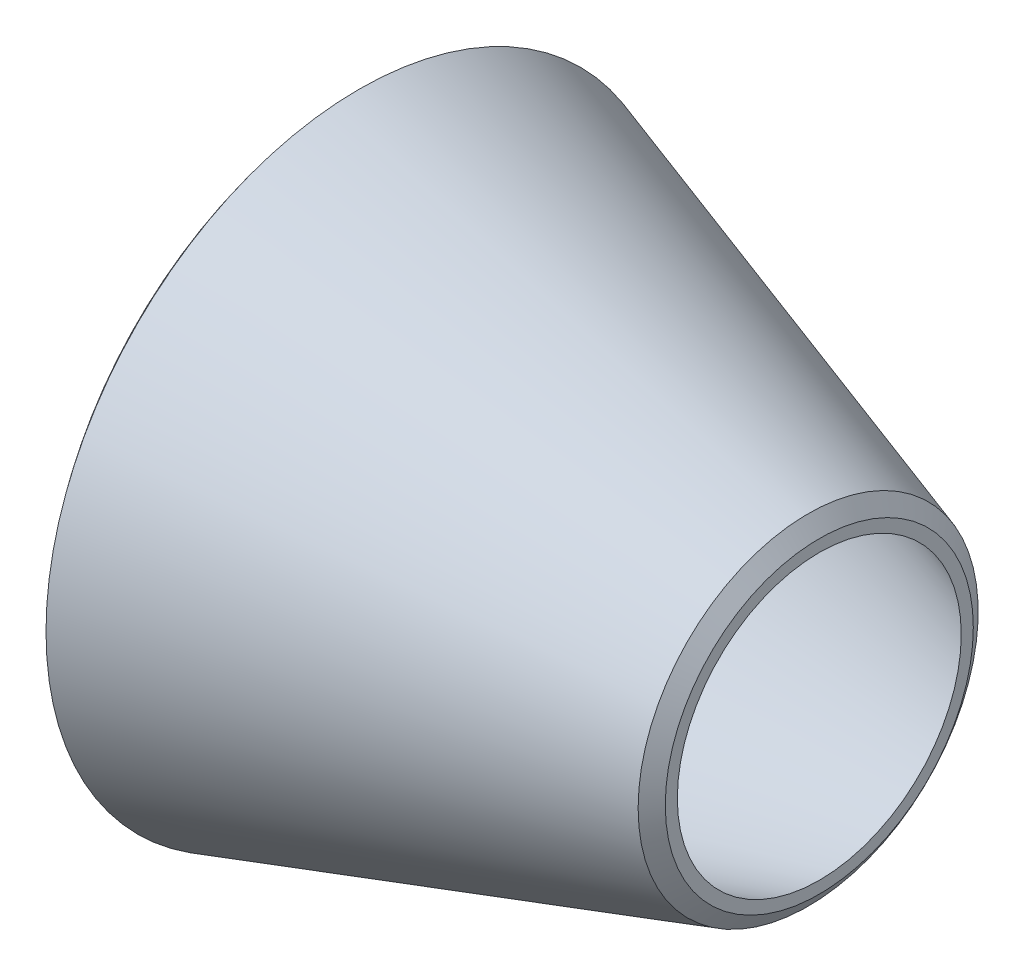
ISO-10303-21;
HEADER;
FILE_DESCRIPTION(('STEP AP214'),'2;1');
FILE_NAME('part.step','',(''),(''),'','','');
FILE_SCHEMA(('AUTOMOTIVE_DESIGN { 1 0 10303 214 1 1 1 1 }'));
ENDSEC;
DATA;
#1=APPLICATION_CONTEXT('core data for automotive mechanical design processes');
#2=APPLICATION_PROTOCOL_DEFINITION('international standard','automotive_design',2000,#1);
#3=PRODUCT_CONTEXT('',#1,'mechanical');
#4=PRODUCT('Part','Part','',(#3));
#5=PRODUCT_RELATED_PRODUCT_CATEGORY('part','',(#4));
#6=PRODUCT_DEFINITION_FORMATION('','',#4);
#7=PRODUCT_DEFINITION_CONTEXT('part definition',#1,'design');
#8=PRODUCT_DEFINITION('design','',#6,#7);
#9=PRODUCT_DEFINITION_SHAPE('','',#8);
#10=(LENGTH_UNIT() NAMED_UNIT(*) SI_UNIT(.MILLI.,.METRE.));
#11=(NAMED_UNIT(*) PLANE_ANGLE_UNIT() SI_UNIT($,.RADIAN.));
#12=(NAMED_UNIT(*) SI_UNIT($,.STERADIAN.) SOLID_ANGLE_UNIT());
#13=UNCERTAINTY_MEASURE_WITH_UNIT(LENGTH_MEASURE(1.E-05),#10,'distance_accuracy_value','');
#14=(GEOMETRIC_REPRESENTATION_CONTEXT(3) GLOBAL_UNCERTAINTY_ASSIGNED_CONTEXT((#13)) GLOBAL_UNIT_ASSIGNED_CONTEXT((#10,
#11,#12)) REPRESENTATION_CONTEXT('',''));
#15=CARTESIAN_POINT('',(0.,0.,0.));
#16=DIRECTION('',(0.,0.,1.));
#17=DIRECTION('',(1.,0.,0.));
#18=AXIS2_PLACEMENT_3D('',#15,#16,#17);
#19=CARTESIAN_POINT('',(79.9999999999983,0.,-7.105427357601E-12));
#20=DIRECTION('',(0.999999999999998,0.,0.));
#21=DIRECTION('',(0.,0.,-1.));
#22=AXIS2_PLACEMENT_3D('',#19,#20,#21);
#23=PLANE('',#22);
#24=CARTESIAN_POINT('',(79.9999999999983,0.,-7.105427357601E-12));
#25=DIRECTION('',(0.999999999999998,0.,0.));
#26=DIRECTION('',(0.,0.,-1.));
#27=AXIS2_PLACEMENT_3D('',#24,#25,#26);
#28=CIRCLE('',#27,26.3677534971864);
#29=CARTESIAN_POINT('',(79.9999999999983,0.,26.3677534971793));
#30=VERTEX_POINT('',#29);
#31=EDGE_CURVE('E72',#30,#30,#28,.T.);
#32=ORIENTED_EDGE('',*,*,#31,.T.);
#33=EDGE_LOOP('',(#32));
#34=FACE_BOUND('',#33,.T.);
#35=CARTESIAN_POINT('',(79.9999999999983,0.,-7.105427357601E-12));
#36=DIRECTION('',(0.999999999999998,0.,0.));
#37=DIRECTION('',(0.,0.,-1.));
#38=AXIS2_PLACEMENT_3D('',#35,#36,#37);
#39=CIRCLE('',#38,24.3017116583065);
#40=CARTESIAN_POINT('',(79.9999999999983,-7.04788094799131E-12,24.3017116583066));
#41=VERTEX_POINT('',#40);
#42=EDGE_CURVE('E78',#41,#41,#39,.T.);
#43=ORIENTED_EDGE('',*,*,#42,.F.);
#44=EDGE_LOOP('',(#43));
#45=FACE_BOUND('',#44,.T.);
#46=ADVANCED_FACE('F57',(#34,#45),#23,.T.);
#47=CARTESIAN_POINT('',(0.,0.,0.));
#48=DIRECTION('',(0.999999999999998,0.,0.));
#49=DIRECTION('',(0.,0.,-1.));
#50=AXIS2_PLACEMENT_3D('',#47,#48,#49);
#51=PLANE('',#50);
#52=CARTESIAN_POINT('',(0.,0.,0.));
#53=DIRECTION('',(0.999999999999998,0.,0.));
#54=DIRECTION('',(0.,0.,-1.));
#55=AXIS2_PLACEMENT_3D('',#52,#53,#54);
#56=CIRCLE('',#55,52.);
#57=CARTESIAN_POINT('',(0.,-1.32782673745169E-13,-52.));
#58=VERTEX_POINT('',#57);
#59=EDGE_CURVE('E12',#58,#58,#56,.F.);
#60=ORIENTED_EDGE('',*,*,#59,.T.);
#61=EDGE_LOOP('',(#60));
#62=FACE_BOUND('',#61,.T.);
#63=CARTESIAN_POINT('',(0.,0.,0.));
#64=DIRECTION('',(0.999999999999998,0.,0.));
#65=DIRECTION('',(0.,0.,-1.));
#66=AXIS2_PLACEMENT_3D('',#63,#64,#65);
#67=CIRCLE('',#66,49.8017116583065);
#68=CARTESIAN_POINT('',(0.,-6.97832547549855E-12,49.8017116583061));
#69=VERTEX_POINT('',#68);
#70=EDGE_CURVE('E77',#69,#69,#67,.T.);
#71=ORIENTED_EDGE('',*,*,#70,.T.);
#72=EDGE_LOOP('',(#71));
#73=FACE_BOUND('',#72,.T.);
#74=ADVANCED_FACE('F84',(#62,#73),#51,.F.);
#75=CARTESIAN_POINT('',(0.,0.,0.));
#76=DIRECTION('',(-0.999999999999998,0.,0.));
#77=DIRECTION('',(0.,0.,1.));
#78=AXIS2_PLACEMENT_3D('',#75,#76,#77);
#79=CONICAL_SURFACE('',#78,54.,0.308568643758517);
#80=CARTESIAN_POINT('',(78.0944615164856,0.,0.));
#81=DIRECTION('',(0.999999999999998,0.,0.));
#82=DIRECTION('',(0.,0.,-1.));
#83=AXIS2_PLACEMENT_3D('',#80,#81,#82);
#84=CIRCLE('',#83,29.1073903916212);
#85=CARTESIAN_POINT('',(78.0944615164856,0.,29.1073903916201));
#86=VERTEX_POINT('',#85);
#87=EDGE_CURVE('E64',#86,#86,#84,.F.);
#88=CARTESIAN_POINT('',(1.23306434455372,0.,0.));
#89=DIRECTION('',(-0.999999999999998,0.,0.));
#90=DIRECTION('',(0.,0.,1.));
#91=AXIS2_PLACEMENT_3D('',#88,#89,#90);
#92=CIRCLE('',#91,53.6069607401725);
#93=CARTESIAN_POINT('',(1.23306434455374,1.36817619994702E-13,53.6069607401735));
#94=VERTEX_POINT('',#93);
#95=EDGE_CURVE('E68',#94,#94,#92,.F.);
#96=CARTESIAN_POINT('',(78.0944615164856,0.,29.1073903916201));
#97=CARTESIAN_POINT('',(77.2938219626113,0.,29.3625942494176));
#98=CARTESIAN_POINT('',(76.493182408737,0.,29.617798107215));
#99=CARTESIAN_POINT('',(74.8919033009884,0.,30.1282058228099));
#100=CARTESIAN_POINT('',(74.0912637471141,0.,30.3834096806073));
#101=CARTESIAN_POINT('',(72.4899846393656,0.,30.8938173962022));
#102=CARTESIAN_POINT('',(71.6893450854913,0.,31.1490212539996));
#103=CARTESIAN_POINT('',(70.0880659777427,0.,31.6594289695944));
#104=CARTESIAN_POINT('',(69.2874264238684,0.,31.9146328273919));
#105=CARTESIAN_POINT('',(67.6861473161198,0.,32.4250405429867));
#106=CARTESIAN_POINT('',(66.8855077622455,0.,32.6802444007842));
#107=CARTESIAN_POINT('',(65.2842286544969,0.,33.190652116379));
#108=CARTESIAN_POINT('',(64.4835891006226,0.,33.4458559741765));
#109=CARTESIAN_POINT('',(62.8823099928741,0.,33.9562636897713));
#110=CARTESIAN_POINT('',(62.0816704389998,0.,34.2114675475687));
#111=CARTESIAN_POINT('',(60.4803913312512,0.,34.7218752631636));
#112=CARTESIAN_POINT('',(59.6797517773769,0.,34.977079120961));
#113=CARTESIAN_POINT('',(58.0784726696283,0.,35.4874868365559));
#114=CARTESIAN_POINT('',(57.277833115754,0.,35.7426906943533));
#115=CARTESIAN_POINT('',(55.6765540080055,0.,36.2530984099482));
#116=CARTESIAN_POINT('',(54.8759144541312,0.,36.5083022677456));
#117=CARTESIAN_POINT('',(53.2746353463826,0.,37.0187099833405));
#118=CARTESIAN_POINT('',(52.4739957925083,0.,37.2739138411379));
#119=CARTESIAN_POINT('',(50.8727166847597,0.,37.7843215567328));
#120=CARTESIAN_POINT('',(50.0720771308854,0.,38.0395254145302));
#121=CARTESIAN_POINT('',(48.4707980231369,0.,38.5499331301251));
#122=CARTESIAN_POINT('',(47.6701584692626,0.,38.8051369879225));
#123=CARTESIAN_POINT('',(46.068879361514,0.,39.3155447035174));
#124=CARTESIAN_POINT('',(45.2682398076397,0.,39.5707485613148));
#125=CARTESIAN_POINT('',(43.6669606998911,0.,40.0811562769096));
#126=CARTESIAN_POINT('',(42.8663211460168,1.00619859391721E-13,40.3363601347071));
#127=CARTESIAN_POINT('',(41.2650420382682,1.02012080953374E-13,40.8467678503019));
#128=CARTESIAN_POINT('',(40.464402484394,1.02708191734201E-13,41.1019717080994));
#129=CARTESIAN_POINT('',(38.8631233766454,1.04100413295854E-13,41.6123794236942));
#130=CARTESIAN_POINT('',(38.0624838227711,1.04796524076681E-13,41.8675832814917));
#131=CARTESIAN_POINT('',(36.4612047150225,1.06188745638334E-13,42.3779909970865));
#132=CARTESIAN_POINT('',(35.6605651611482,1.0688485641916E-13,42.6331948548839));
#133=CARTESIAN_POINT('',(34.0592860533996,1.08277077980813E-13,43.1436025704788));
#134=CARTESIAN_POINT('',(33.2586464995253,1.0897318876164E-13,43.3988064282762));
#135=CARTESIAN_POINT('',(31.6573673917768,1.10365410323293E-13,43.9092141438711));
#136=CARTESIAN_POINT('',(30.8567278379025,1.11061521104119E-13,44.1644180016685));
#137=CARTESIAN_POINT('',(29.2554487301539,1.12453742665773E-13,44.6748257172634));
#138=CARTESIAN_POINT('',(28.4548091762796,1.13149853446599E-13,44.9300295750608));
#139=CARTESIAN_POINT('',(26.853530068531,1.14542075008252E-13,45.4404372906557));
#140=CARTESIAN_POINT('',(26.0528905146567,1.15238185789079E-13,45.6956411484531));
#141=CARTESIAN_POINT('',(24.4516114069082,1.16630407350732E-13,46.206048864048));
#142=CARTESIAN_POINT('',(23.6509718530339,1.17326518131558E-13,46.4612527218454));
#143=CARTESIAN_POINT('',(22.0496927452853,1.18718739693211E-13,46.9716604374403));
#144=CARTESIAN_POINT('',(21.249053191411,1.19414850474038E-13,47.2268642952377));
#145=CARTESIAN_POINT('',(19.6477740836624,1.20807072035691E-13,47.7372720108326));
#146=CARTESIAN_POINT('',(18.8471345297881,1.21503182816518E-13,47.99247586863));
#147=CARTESIAN_POINT('',(17.2458554220395,1.22895404378171E-13,48.5028835842249));
#148=CARTESIAN_POINT('',(16.4452158681652,1.23591515158997E-13,48.7580874420223));
#149=CARTESIAN_POINT('',(14.8439367604167,1.2498373672065E-13,49.2684951576171));
#150=CARTESIAN_POINT('',(14.0432972065424,1.25679847501477E-13,49.5236990154146));
#151=CARTESIAN_POINT('',(12.4420180987938,1.2707206906313E-13,50.0341067310094));
#152=CARTESIAN_POINT('',(11.6413785449195,1.27768179843957E-13,50.2893105888069));
#153=CARTESIAN_POINT('',(10.0400994371709,1.2916040140561E-13,50.7997183044017));
#154=CARTESIAN_POINT('',(9.23945988329664,1.29856512186436E-13,51.0549221621992));
#155=CARTESIAN_POINT('',(7.63818077554807,1.31248733748089E-13,51.565329877794));
#156=CARTESIAN_POINT('',(6.83754122167378,1.31944844528916E-13,51.8205337355915));
#157=CARTESIAN_POINT('',(5.23626211392519,1.33337066090569E-13,52.3309414511863));
#158=CARTESIAN_POINT('',(4.4356225600509,1.34033176871395E-13,52.5861453089838));
#159=CARTESIAN_POINT('',(2.83434345230232,1.35425398433049E-13,53.0965530245786));
#160=CARTESIAN_POINT('',(2.03370389842803,1.36121509213875E-13,53.351756882376));
#161=CARTESIAN_POINT('',(1.23306434455374,1.36817619994702E-13,53.6069607401735));
#162=B_SPLINE_CURVE_WITH_KNOTS('',3,(#96,#97,#98,#99,#100,#101,#102,#103,#104,#105,#106,#107,
#108,#109,#110,#111,#112,#113,#114,#115,#116,#117,#118,#119,#120,#121,#122,#123,#124,#125,#126,
#127,#128,#129,#130,#131,#132,#133,#134,#135,#136,#137,#138,#139,#140,#141,#142,#143,#144,#145,
#146,#147,#148,#149,#150,#151,#152,#153,#154,#155,#156,#157,#158,#159,#160,#161),.UNSPECIFIED.,
.F.,.F.,(4,2,2,2,2,2,2,2,2,2,2,2,2,2,2,2,2,2,2,2,2,2,2,2,2,2,2,2,2,2,2,2,4),(0.,
2.52098677869687,5.04197355739374,7.56296033609061,10.0839471147875,12.6049338934844,
15.1259206721812,17.6469074508781,20.167894229575,22.6888810082718,25.2098677869687,
27.7308545656656,30.2518413443624,32.7728281230593,35.2938149017562,37.814801680453,
40.3357884591499,42.8567752378468,45.3777620165437,47.8987487952405,50.4197355739374,
52.9407223526343,55.4617091313311,57.982695910028,60.5036826887249,63.0246694674217,
65.5456562461186,68.0666430248155,70.5876298035124,73.1086165822092,75.6296033609061,
78.150590139603,80.6715769182998),.UNSPECIFIED.);
#163=EDGE_CURVE('BSEAM90',#86,#94,#162,.T.);
#164=ORIENTED_EDGE('',*,*,#87,.T.);
#165=ORIENTED_EDGE('',*,*,#95,.T.);
#166=ORIENTED_EDGE('',*,*,#163,.T.);
#167=ORIENTED_EDGE('',*,*,#163,.F.);
#168=EDGE_LOOP('',(#164,#166,#165,#167));
#169=FACE_BOUND('',#168,.T.);
#170=ADVANCED_FACE('F90',(#169),#79,.T.);
#171=CARTESIAN_POINT('',(-1.21478078324344,-7.105427357601E-12,0.));
#172=DIRECTION('',(-0.999999999999998,0.,0.));
#173=DIRECTION('',(0.,0.,1.));
#174=AXIS2_PLACEMENT_3D('',#171,#172,#173);
#175=CONICAL_SURFACE('',#174,50.188923032965,0.308568643758517);
#176=CARTESIAN_POINT('',(0.,-6.97832547549855E-12,49.8017116583061));
#177=CARTESIAN_POINT('',(0.833333333333328,-6.97905001167034E-12,49.5360866583061));
#178=CARTESIAN_POINT('',(1.66666666666664,-6.97977454784214E-12,49.2704616583061));
#179=CARTESIAN_POINT('',(3.33333333333327,-6.98122362018574E-12,48.7392116583061));
#180=CARTESIAN_POINT('',(4.16666666666659,-6.98194815635754E-12,48.4735866583061));
#181=CARTESIAN_POINT('',(5.83333333333322,-6.98339722870114E-12,47.9423366583061));
#182=CARTESIAN_POINT('',(6.66666666666654,-6.98412176487294E-12,47.6767116583061));
#183=CARTESIAN_POINT('',(8.33333333333317,-6.98557083721654E-12,47.1454616583061));
#184=CARTESIAN_POINT('',(9.16666666666648,-6.98629537338834E-12,46.8798366583061));
#185=CARTESIAN_POINT('',(10.8333333333331,-6.98774444573194E-12,46.3485866583062));
#186=CARTESIAN_POINT('',(11.6666666666664,-6.98846898190374E-12,46.0829616583062));
#187=CARTESIAN_POINT('',(13.3333333333331,-6.98991805424734E-12,45.5517116583062));
#188=CARTESIAN_POINT('',(14.1666666666664,-6.99064259041914E-12,45.2860866583062));
#189=CARTESIAN_POINT('',(15.833333333333,-6.99209166276274E-12,44.7548366583062));
#190=CARTESIAN_POINT('',(16.6666666666663,-6.99281619893454E-12,44.4892116583062));
#191=CARTESIAN_POINT('',(18.333333333333,-6.99426527127814E-12,43.9579616583062));
#192=CARTESIAN_POINT('',(19.1666666666663,-6.99498980744994E-12,43.6923366583062));
#193=CARTESIAN_POINT('',(20.8333333333329,-6.99643887979354E-12,43.1610866583062));
#194=CARTESIAN_POINT('',(21.6666666666662,-6.99716341596534E-12,42.8954616583062));
#195=CARTESIAN_POINT('',(23.3333333333328,-6.99861248830894E-12,42.3642116583062));
#196=CARTESIAN_POINT('',(24.1666666666662,-6.99933702448074E-12,42.0985866583062));
#197=CARTESIAN_POINT('',(25.8333333333328,-7.00078609682433E-12,41.5673366583062));
#198=CARTESIAN_POINT('',(26.6666666666661,-7.00151063299613E-12,41.3017116583063));
#199=CARTESIAN_POINT('',(28.3333333333327,-7.00295970533973E-12,40.7704616583063));
#200=CARTESIAN_POINT('',(29.166666666666,-7.00368424151153E-12,40.5048366583063));
#201=CARTESIAN_POINT('',(30.8333333333327,-7.00513331385513E-12,39.9735866583063));
#202=CARTESIAN_POINT('',(31.666666666666,-7.00585785002693E-12,39.7079616583063));
#203=CARTESIAN_POINT('',(33.3333333333326,-7.00730692237053E-12,39.1767116583063));
#204=CARTESIAN_POINT('',(34.1666666666659,-7.00803145854233E-12,38.9110866583063));
#205=CARTESIAN_POINT('',(35.8333333333326,-7.00948053088593E-12,38.3798366583063));
#206=CARTESIAN_POINT('',(36.6666666666659,-7.01020506705773E-12,38.1142116583063));
#207=CARTESIAN_POINT('',(38.3333333333325,-7.01165413940133E-12,37.5829616583063));
#208=CARTESIAN_POINT('',(39.1666666666658,-7.01237867557313E-12,37.3173366583063));
#209=CARTESIAN_POINT('',(40.8333333333325,-7.01382774791673E-12,36.7860866583063));
#210=CARTESIAN_POINT('',(41.6666666666658,-7.01455228408853E-12,36.5204616583064));
#211=CARTESIAN_POINT('',(43.3333333333324,-7.01600135643213E-12,35.9892116583064));
#212=CARTESIAN_POINT('',(44.1666666666657,-7.01672589260393E-12,35.7235866583064));
#213=CARTESIAN_POINT('',(45.8333333333324,-7.01817496494753E-12,35.1923366583064));
#214=CARTESIAN_POINT('',(46.6666666666657,-7.01889950111932E-12,34.9267116583064));
#215=CARTESIAN_POINT('',(48.3333333333323,-7.02034857346292E-12,34.3954616583064));
#216=CARTESIAN_POINT('',(49.1666666666656,-7.02107310963472E-12,34.1298366583064));
#217=CARTESIAN_POINT('',(50.8333333333322,-7.02252218197832E-12,33.5985866583064));
#218=CARTESIAN_POINT('',(51.6666666666656,-7.02324671815012E-12,33.3329616583064));
#219=CARTESIAN_POINT('',(53.3333333333322,-7.02469579049372E-12,32.8017116583064));
#220=CARTESIAN_POINT('',(54.1666666666655,-7.02542032666552E-12,32.5360866583064));
#221=CARTESIAN_POINT('',(55.8333333333321,-7.02686939900912E-12,32.0048366583064));
#222=CARTESIAN_POINT('',(56.6666666666654,-7.02759393518092E-12,31.7392116583064));
#223=CARTESIAN_POINT('',(58.3333333333321,-7.02904300752452E-12,31.2079616583065));
#224=CARTESIAN_POINT('',(59.1666666666654,-7.02976754369632E-12,30.9423366583065));
#225=CARTESIAN_POINT('',(60.833333333332,-7.03121661603992E-12,30.4110866583065));
#226=CARTESIAN_POINT('',(61.6666666666653,-7.03194115221172E-12,30.1454616583065));
#227=CARTESIAN_POINT('',(63.333333333332,-7.03339022455532E-12,29.6142116583065));
#228=CARTESIAN_POINT('',(64.1666666666653,-7.03411476072712E-12,29.3485866583065));
#229=CARTESIAN_POINT('',(65.8333333333319,-7.03556383307072E-12,28.8173366583065));
#230=CARTESIAN_POINT('',(66.6666666666653,-7.03628836924252E-12,28.5517116583065));
#231=CARTESIAN_POINT('',(68.3333333333319,-7.03773744158612E-12,28.0204616583065));
#232=CARTESIAN_POINT('',(69.1666666666652,-7.03846197775792E-12,27.7548366583065));
#233=CARTESIAN_POINT('',(70.8333333333318,-7.03991105010151E-12,27.2235866583065));
#234=CARTESIAN_POINT('',(71.6666666666651,-7.04063558627331E-12,26.9579616583065));
#235=CARTESIAN_POINT('',(73.3333333333318,-7.04208465861691E-12,26.4267116583065));
#236=CARTESIAN_POINT('',(74.1666666666651,-7.04280919478871E-12,26.1610866583065));
#237=CARTESIAN_POINT('',(75.8333333333317,-7.04425826713231E-12,25.6298366583066));
#238=CARTESIAN_POINT('',(76.666666666665,-7.04498280330411E-12,25.3642116583066));
#239=CARTESIAN_POINT('',(78.3333333333317,-7.04643187564771E-12,24.8329616583066));
#240=CARTESIAN_POINT('',(79.166666666665,-7.04715641181951E-12,24.5673366583066));
#241=CARTESIAN_POINT('',(79.9999999999983,-7.04788094799131E-12,24.3017116583066));
#242=B_SPLINE_CURVE_WITH_KNOTS('',3,(#176,#177,#178,#179,#180,#181,#182,#183,#184,#185,#186,
#187,#188,#189,#190,#191,#192,#193,#194,#195,#196,#197,#198,#199,#200,#201,#202,#203,#204,#205,
#206,#207,#208,#209,#210,#211,#212,#213,#214,#215,#216,#217,#218,#219,#220,#221,#222,#223,#224,
#225,#226,#227,#228,#229,#230,#231,#232,#233,#234,#235,#236,#237,#238,#239,#240,#241),
.UNSPECIFIED.,.F.,.F.,(4,2,2,2,2,2,2,2,2,2,2,2,2,2,2,2,2,2,2,2,2,2,2,2,2,2,2,2,2,2,2,2,4),(0.,
2.62393021355842,5.24786042711683,7.87179064067524,10.4957208542337,13.1196510677921,
15.7435812813505,18.3675114949089,20.9914417084673,23.6153719220257,26.2393021355841,
28.8632323491426,31.487162562701,34.1110927762594,36.7350229898178,39.3589532033762,
41.9828834169346,44.6068136304931,47.2307438440515,49.8546740576099,52.4786042711683,
55.1025344847267,57.7264646982851,60.3503949118435,62.9743251254019,65.5982553389604,
68.2221855525188,70.8461157660772,73.4700459796356,76.0939761931941,78.7179064067525,
81.3418366203109,83.9657668338693),.UNSPECIFIED.);
#243=EDGE_CURVE('BSEAM86',#69,#41,#242,.T.);
#244=ORIENTED_EDGE('',*,*,#70,.F.);
#245=ORIENTED_EDGE('',*,*,#42,.T.);
#246=ORIENTED_EDGE('',*,*,#243,.T.);
#247=ORIENTED_EDGE('',*,*,#243,.F.);
#248=EDGE_LOOP('',(#244,#246,#245,#247));
#249=FACE_BOUND('',#248,.T.);
#250=ADVANCED_FACE('F86',(#249),#175,.F.);
#251=CARTESIAN_POINT('',(79.9999999999983,0.,-7.105427357601E-12));
#252=DIRECTION('',(-0.999999999999998,0.,0.));
#253=DIRECTION('',(0.,0.,1.));
#254=AXIS2_PLACEMENT_3D('',#251,#252,#253);
#255=CONICAL_SURFACE('',#254,26.3677534971864,0.963067113256386);
#256=CARTESIAN_POINT('',(78.0944615164856,0.,29.1073903916072));
#257=CARTESIAN_POINT('',(78.1143108756889,0.,29.0788525072902));
#258=CARTESIAN_POINT('',(78.1341602348921,0.,29.0503146229733));
#259=CARTESIAN_POINT('',(78.1738589532986,0.,28.9932388543393));
#260=CARTESIAN_POINT('',(78.1937083125019,0.,28.9647009700224));
#261=CARTESIAN_POINT('',(78.2334070309084,0.,28.9076252013885));
#262=CARTESIAN_POINT('',(78.2532563901117,0.,28.8790873170715));
#263=CARTESIAN_POINT('',(78.2929551085182,0.,28.8220115484376));
#264=CARTESIAN_POINT('',(78.3128044677214,0.,28.7934736641206));
#265=CARTESIAN_POINT('',(78.3525031861279,0.,28.7363978954867));
#266=CARTESIAN_POINT('',(78.3723525453312,0.,28.7078600111698));
#267=CARTESIAN_POINT('',(78.4120512637377,0.,28.6507842425359));
#268=CARTESIAN_POINT('',(78.431900622941,0.,28.6222463582189));
#269=CARTESIAN_POINT('',(78.4715993413475,0.,28.565170589585));
#270=CARTESIAN_POINT('',(78.4914487005507,0.,28.536632705268));
#271=CARTESIAN_POINT('',(78.5311474189572,0.,28.4795569366341));
#272=CARTESIAN_POINT('',(78.5509967781605,0.,28.4510190523172));
#273=CARTESIAN_POINT('',(78.590695496567,0.,28.3939432836832));
#274=CARTESIAN_POINT('',(78.6105448557703,0.,28.3654053993663));
#275=CARTESIAN_POINT('',(78.6502435741768,0.,28.3083296307324));
#276=CARTESIAN_POINT('',(78.6700929333801,0.,28.2797917464154));
#277=CARTESIAN_POINT('',(78.7097916517866,0.,28.2227159777815));
#278=CARTESIAN_POINT('',(78.7296410109898,0.,28.1941780934645));
#279=CARTESIAN_POINT('',(78.7693397293963,0.,28.1371023248306));
#280=CARTESIAN_POINT('',(78.7891890885996,0.,28.1085644405137));
#281=CARTESIAN_POINT('',(78.8288878070061,0.,28.0514886718798));
#282=CARTESIAN_POINT('',(78.8487371662094,0.,28.0229507875628));
#283=CARTESIAN_POINT('',(78.8884358846159,0.,27.9658750189289));
#284=CARTESIAN_POINT('',(78.9082852438191,0.,27.9373371346119));
#285=CARTESIAN_POINT('',(78.9479839622256,0.,27.880261365978));
#286=CARTESIAN_POINT('',(78.9678333214289,0.,27.8517234816611));
#287=CARTESIAN_POINT('',(79.0075320398354,0.,27.7946477130271));
#288=CARTESIAN_POINT('',(79.0273813990387,0.,27.7661098287102));
#289=CARTESIAN_POINT('',(79.0670801174452,0.,27.7090340600763));
#290=CARTESIAN_POINT('',(79.0869294766485,0.,27.6804961757593));
#291=CARTESIAN_POINT('',(79.126628195055,0.,27.6234204071254));
#292=CARTESIAN_POINT('',(79.1464775542582,0.,27.5948825228084));
#293=CARTESIAN_POINT('',(79.1861762726648,0.,27.5378067541745));
#294=CARTESIAN_POINT('',(79.206025631868,0.,27.5092688698576));
#295=CARTESIAN_POINT('',(79.2457243502745,0.,27.4521931012237));
#296=CARTESIAN_POINT('',(79.2655737094778,0.,27.4236552169067));
#297=CARTESIAN_POINT('',(79.3052724278843,0.,27.3665794482728));
#298=CARTESIAN_POINT('',(79.3251217870875,0.,27.3380415639558));
#299=CARTESIAN_POINT('',(79.3648205054941,0.,27.2809657953219));
#300=CARTESIAN_POINT('',(79.3846698646973,0.,27.252427911005));
#301=CARTESIAN_POINT('',(79.4243685831038,0.,27.195352142371));
#302=CARTESIAN_POINT('',(79.4442179423071,0.,27.1668142580541));
#303=CARTESIAN_POINT('',(79.4839166607136,0.,27.1097384894202));
#304=CARTESIAN_POINT('',(79.5037660199169,0.,27.0812006051032));
#305=CARTESIAN_POINT('',(79.5434647383234,0.,27.0241248364693));
#306=CARTESIAN_POINT('',(79.5633140975266,0.,26.9955869521523));
#307=CARTESIAN_POINT('',(79.6030128159331,0.,26.9385111835184));
#308=CARTESIAN_POINT('',(79.6228621751364,0.,26.9099732992015));
#309=CARTESIAN_POINT('',(79.6625608935429,0.,26.8528975305676));
#310=CARTESIAN_POINT('',(79.6824102527462,0.,26.8243596462506));
#311=CARTESIAN_POINT('',(79.7221089711527,0.,26.7672838776167));
#312=CARTESIAN_POINT('',(79.741958330356,0.,26.7387459932997));
#313=CARTESIAN_POINT('',(79.7816570487625,0.,26.6816702246658));
#314=CARTESIAN_POINT('',(79.8015064079657,0.,26.6531323403489));
#315=CARTESIAN_POINT('',(79.8412051263722,0.,26.5960565717149));
#316=CARTESIAN_POINT('',(79.8610544855755,0.,26.567518687398));
#317=CARTESIAN_POINT('',(79.900753203982,0.,26.5104429187641));
#318=CARTESIAN_POINT('',(79.9206025631853,0.,26.4819050344471));
#319=CARTESIAN_POINT('',(79.9603012815918,0.,26.4248292658132));
#320=CARTESIAN_POINT('',(79.980150640795,0.,26.3962913814962));
#321=CARTESIAN_POINT('',(79.9999999999983,0.,26.3677534971793));
#322=B_SPLINE_CURVE_WITH_KNOTS('',3,(#256,#257,#258,#259,#260,#261,#262,#263,#264,#265,#266,
#267,#268,#269,#270,#271,#272,#273,#274,#275,#276,#277,#278,#279,#280,#281,#282,#283,#284,#285,
#286,#287,#288,#289,#290,#291,#292,#293,#294,#295,#296,#297,#298,#299,#300,#301,#302,#303,#304,
#305,#306,#307,#308,#309,#310,#311,#312,#313,#314,#315,#316,#317,#318,#319,#320,#321),
.UNSPECIFIED.,.F.,.F.,(4,2,2,2,2,2,2,2,2,2,2,2,2,2,2,2,2,2,2,2,2,2,2,2,2,2,2,2,2,2,2,2,4),(0.,
0.104286485790882,0.208572971581753,0.312859457372643,0.417145943163518,0.521432428954408,
0.62571891474529,0.730005400536161,0.834291886327043,0.938578372117925,1.04286485790881,
1.14715134369969,1.25143782949058,1.35572431528146,1.46001080107233,1.56429728686321,
1.6685837726541,1.77287025844498,1.87715674423586,1.98144323002675,2.08572971581762,
2.19001620160851,2.29430268739938,2.39858917319026,2.50287565898115,2.60716214477202,
2.71144863056291,2.81573511635379,2.92002160214468,3.02430808793555,3.12859457372644,
3.23288105951731,3.33716754530819),.UNSPECIFIED.);
#323=EDGE_CURVE('BSEAM89',#86,#30,#322,.T.);
#324=ORIENTED_EDGE('',*,*,#87,.F.);
#325=ORIENTED_EDGE('',*,*,#31,.F.);
#326=ORIENTED_EDGE('',*,*,#323,.T.);
#327=ORIENTED_EDGE('',*,*,#323,.F.);
#328=EDGE_LOOP('',(#324,#326,#325,#327));
#329=FACE_BOUND('',#328,.T.);
#330=ADVANCED_FACE('F89',(#329),#255,.T.);
#331=CARTESIAN_POINT('',(1.23306434455372,0.,0.));
#332=DIRECTION('',(0.999999999999998,0.,0.));
#333=DIRECTION('',(0.,0.,-1.));
#334=AXIS2_PLACEMENT_3D('',#331,#332,#333);
#335=CONICAL_SURFACE('',#334,53.6069607401725,0.916297857297029);
#336=ORIENTED_EDGE('',*,*,#59,.F.);
#337=EDGE_LOOP('',(#336));
#338=FACE_BOUND('',#337,.T.);
#339=ORIENTED_EDGE('',*,*,#95,.F.);
#340=EDGE_LOOP('',(#339));
#341=FACE_BOUND('',#340,.T.);
#342=ADVANCED_FACE('F59',(#338,#341),#335,.T.);
#343=CLOSED_SHELL('',(#46,#74,#170,#250,#330,#342));
#344=MANIFOLD_SOLID_BREP('B2',#343);
#345=ADVANCED_BREP_SHAPE_REPRESENTATION('',(#18,#344),#14);
#346=SHAPE_DEFINITION_REPRESENTATION(#9,#345);
ENDSEC;
END-ISO-10303-21;
